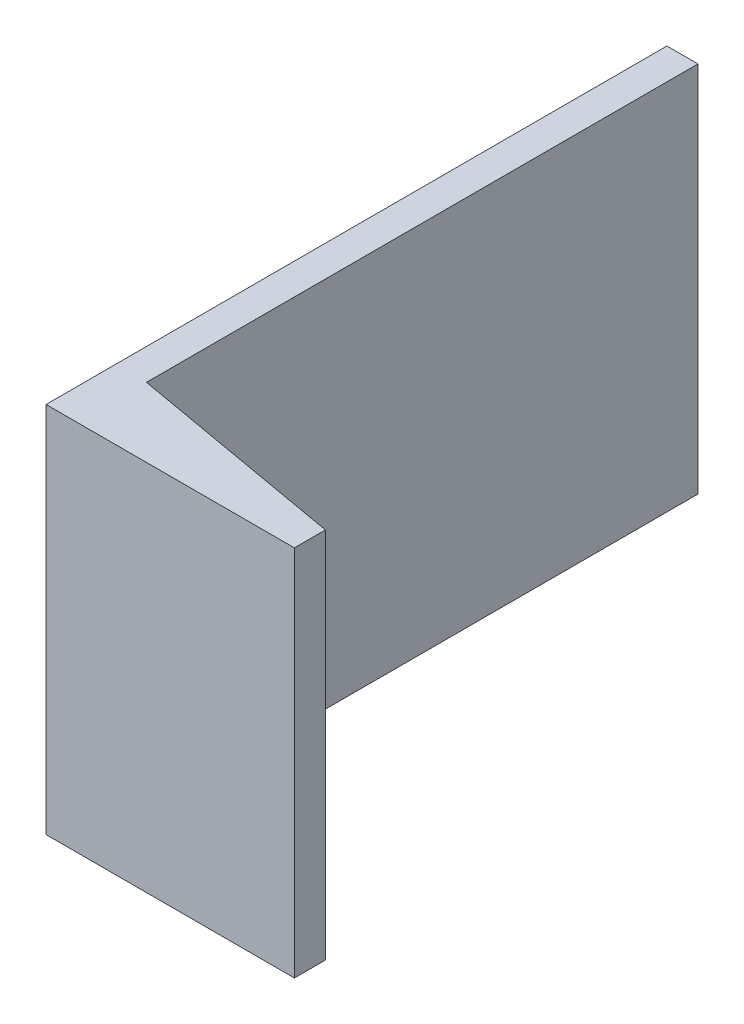
ISO-10303-21;
HEADER;
FILE_DESCRIPTION(('STEP AP214'),'2;1');
FILE_NAME('part.step','',(''),(''),'','','');
FILE_SCHEMA(('AUTOMOTIVE_DESIGN { 1 0 10303 214 1 1 1 1 }'));
ENDSEC;
DATA;
#1=APPLICATION_CONTEXT('core data for automotive mechanical design processes');
#2=APPLICATION_PROTOCOL_DEFINITION('international standard','automotive_design',2000,#1);
#3=PRODUCT_CONTEXT('',#1,'mechanical');
#4=PRODUCT('Part','Part','',(#3));
#5=PRODUCT_RELATED_PRODUCT_CATEGORY('part','',(#4));
#6=PRODUCT_DEFINITION_FORMATION('','',#4);
#7=PRODUCT_DEFINITION_CONTEXT('part definition',#1,'design');
#8=PRODUCT_DEFINITION('design','',#6,#7);
#9=PRODUCT_DEFINITION_SHAPE('','',#8);
#10=(LENGTH_UNIT() NAMED_UNIT(*) SI_UNIT(.MILLI.,.METRE.));
#11=(NAMED_UNIT(*) PLANE_ANGLE_UNIT() SI_UNIT($,.RADIAN.));
#12=(NAMED_UNIT(*) SI_UNIT($,.STERADIAN.) SOLID_ANGLE_UNIT());
#13=UNCERTAINTY_MEASURE_WITH_UNIT(LENGTH_MEASURE(1.E-05),#10,'distance_accuracy_value','');
#14=(GEOMETRIC_REPRESENTATION_CONTEXT(3) GLOBAL_UNCERTAINTY_ASSIGNED_CONTEXT((#13)) GLOBAL_UNIT_ASSIGNED_CONTEXT((#10,
#11,#12)) REPRESENTATION_CONTEXT('',''));
#15=CARTESIAN_POINT('',(0.,0.,0.));
#16=DIRECTION('',(0.,0.,1.));
#17=DIRECTION('',(1.,0.,0.));
#18=AXIS2_PLACEMENT_3D('',#15,#16,#17);
#19=CARTESIAN_POINT('',(0.,76.2,-127.));
#20=DIRECTION('',(1.,0.,0.));
#21=DIRECTION('',(0.,0.,-1.));
#22=AXIS2_PLACEMENT_3D('',#19,#20,#21);
#23=PLANE('',#22);
#24=DIRECTION('',(0.,0.,1.));
#25=VECTOR('',#24,1.);
#26=CARTESIAN_POINT('',(0.,0.,-127.));
#27=LINE('',#26,#25);
#28=CARTESIAN_POINT('',(0.,0.,-127.));
#29=VERTEX_POINT('',#28);
#30=CARTESIAN_POINT('',(0.,0.,0.));
#31=VERTEX_POINT('',#30);
#32=EDGE_CURVE('E117',#29,#31,#27,.T.);
#33=ORIENTED_EDGE('',*,*,#32,.T.);
#34=DIRECTION('',(0.,-1.,0.));
#35=VECTOR('',#34,1.);
#36=CARTESIAN_POINT('',(0.,76.2,0.));
#37=LINE('',#36,#35);
#38=CARTESIAN_POINT('',(0.,76.2,0.));
#39=VERTEX_POINT('',#38);
#40=EDGE_CURVE('E11',#39,#31,#37,.T.);
#41=ORIENTED_EDGE('',*,*,#40,.F.);
#42=DIRECTION('',(0.,0.,1.));
#43=VECTOR('',#42,1.);
#44=CARTESIAN_POINT('',(0.,76.2,-127.));
#45=LINE('',#44,#43);
#46=CARTESIAN_POINT('',(0.,76.2,-127.));
#47=VERTEX_POINT('',#46);
#48=EDGE_CURVE('E127',#47,#39,#45,.T.);
#49=ORIENTED_EDGE('',*,*,#48,.F.);
#50=DIRECTION('',(0.,-1.,0.));
#51=VECTOR('',#50,1.);
#52=CARTESIAN_POINT('',(0.,76.2,-127.));
#53=LINE('',#52,#51);
#54=EDGE_CURVE('E113',#47,#29,#53,.T.);
#55=ORIENTED_EDGE('',*,*,#54,.T.);
#56=EDGE_LOOP('',(#33,#41,#49,#55));
#57=FACE_BOUND('',#56,.T.);
#58=ADVANCED_FACE('F33',(#57),#23,.F.);
#59=CARTESIAN_POINT('',(0.,76.2,0.));
#60=DIRECTION('',(0.,0.,-1.));
#61=DIRECTION('',(-1.,0.,0.));
#62=AXIS2_PLACEMENT_3D('',#59,#60,#61);
#63=PLANE('',#62);
#64=DIRECTION('',(1.,0.,0.));
#65=VECTOR('',#64,1.);
#66=CARTESIAN_POINT('',(0.,0.,0.));
#67=LINE('',#66,#65);
#68=CARTESIAN_POINT('',(50.8,0.,0.));
#69=VERTEX_POINT('',#68);
#70=EDGE_CURVE('E120',#31,#69,#67,.T.);
#71=ORIENTED_EDGE('',*,*,#70,.T.);
#72=DIRECTION('',(0.,-1.,0.));
#73=VECTOR('',#72,1.);
#74=CARTESIAN_POINT('',(50.8,76.2,0.));
#75=LINE('',#74,#73);
#76=CARTESIAN_POINT('',(50.8,76.2,0.));
#77=VERTEX_POINT('',#76);
#78=EDGE_CURVE('E41',#77,#69,#75,.T.);
#79=ORIENTED_EDGE('',*,*,#78,.F.);
#80=DIRECTION('',(1.,0.,0.));
#81=VECTOR('',#80,1.);
#82=CARTESIAN_POINT('',(0.,76.2,0.));
#83=LINE('',#82,#81);
#84=EDGE_CURVE('E86',#39,#77,#83,.T.);
#85=ORIENTED_EDGE('',*,*,#84,.F.);
#86=ORIENTED_EDGE('',*,*,#40,.T.);
#87=EDGE_LOOP('',(#71,#79,#85,#86));
#88=FACE_BOUND('',#87,.T.);
#89=ADVANCED_FACE('F151',(#88),#63,.F.);
#90=CARTESIAN_POINT('',(50.8,76.2,0.));
#91=DIRECTION('',(-1.,0.,0.));
#92=DIRECTION('',(0.,0.,1.));
#93=AXIS2_PLACEMENT_3D('',#90,#91,#92);
#94=PLANE('',#93);
#95=DIRECTION('',(0.,0.,-1.));
#96=VECTOR('',#95,1.);
#97=CARTESIAN_POINT('',(50.8,0.,0.));
#98=LINE('',#97,#96);
#99=CARTESIAN_POINT('',(50.8,0.,-6.35));
#100=VERTEX_POINT('',#99);
#101=EDGE_CURVE('E122',#69,#100,#98,.T.);
#102=ORIENTED_EDGE('',*,*,#101,.T.);
#103=DIRECTION('',(0.,-1.,0.));
#104=VECTOR('',#103,1.);
#105=CARTESIAN_POINT('',(50.8,76.2,-6.35));
#106=LINE('',#105,#104);
#107=CARTESIAN_POINT('',(50.8,76.2,-6.35));
#108=VERTEX_POINT('',#107);
#109=EDGE_CURVE('E108',#108,#100,#106,.T.);
#110=ORIENTED_EDGE('',*,*,#109,.F.);
#111=DIRECTION('',(0.,0.,-1.));
#112=VECTOR('',#111,1.);
#113=CARTESIAN_POINT('',(50.8,76.2,0.));
#114=LINE('',#113,#112);
#115=EDGE_CURVE('E99',#77,#108,#114,.T.);
#116=ORIENTED_EDGE('',*,*,#115,.F.);
#117=ORIENTED_EDGE('',*,*,#78,.T.);
#118=EDGE_LOOP('',(#102,#110,#116,#117));
#119=FACE_BOUND('',#118,.T.);
#120=ADVANCED_FACE('F133',(#119),#94,.F.);
#121=CARTESIAN_POINT('',(50.8,76.2,-6.35));
#122=DIRECTION('',(-0.173648177666923,0.,0.984807753012209));
#123=DIRECTION('',(0.984807753012209,0.,0.173648177666923));
#124=AXIS2_PLACEMENT_3D('',#121,#122,#123);
#125=PLANE('',#124);
#126=DIRECTION('',(-0.984807753012209,0.,-0.173648177666923));
#127=VECTOR('',#126,1.);
#128=CARTESIAN_POINT('',(50.8,0.,-6.35));
#129=LINE('',#128,#127);
#130=CARTESIAN_POINT('',(6.35000000000002,0.,-14.1877342924909));
#131=VERTEX_POINT('',#130);
#132=EDGE_CURVE('E107',#100,#131,#129,.T.);
#133=ORIENTED_EDGE('',*,*,#132,.T.);
#134=DIRECTION('',(0.,-1.,0.));
#135=VECTOR('',#134,1.);
#136=CARTESIAN_POINT('',(6.35000000000002,76.2,-14.1877342924909));
#137=LINE('',#136,#135);
#138=CARTESIAN_POINT('',(6.35000000000002,76.2,-14.1877342924909));
#139=VERTEX_POINT('',#138);
#140=EDGE_CURVE('E104',#139,#131,#137,.T.);
#141=ORIENTED_EDGE('',*,*,#140,.F.);
#142=DIRECTION('',(-0.984807753012209,0.,-0.173648177666923));
#143=VECTOR('',#142,1.);
#144=CARTESIAN_POINT('',(50.8,76.2,-6.35));
#145=LINE('',#144,#143);
#146=EDGE_CURVE('E93',#108,#139,#145,.T.);
#147=ORIENTED_EDGE('',*,*,#146,.F.);
#148=ORIENTED_EDGE('',*,*,#109,.T.);
#149=EDGE_LOOP('',(#133,#141,#147,#148));
#150=FACE_BOUND('',#149,.T.);
#151=ADVANCED_FACE('F105',(#150),#125,.F.);
#152=CARTESIAN_POINT('',(6.35000000000002,76.2,-14.1877342924909));
#153=DIRECTION('',(-1.,0.,0.));
#154=DIRECTION('',(0.,0.,1.));
#155=AXIS2_PLACEMENT_3D('',#152,#153,#154);
#156=PLANE('',#155);
#157=DIRECTION('',(0.,0.,-1.));
#158=VECTOR('',#157,1.);
#159=CARTESIAN_POINT('',(6.35000000000002,0.,-14.1877342924909));
#160=LINE('',#159,#158);
#161=CARTESIAN_POINT('',(6.35000000000001,0.,-127.));
#162=VERTEX_POINT('',#161);
#163=EDGE_CURVE('E72',#131,#162,#160,.T.);
#164=ORIENTED_EDGE('',*,*,#163,.T.);
#165=DIRECTION('',(0.,-1.,0.));
#166=VECTOR('',#165,1.);
#167=CARTESIAN_POINT('',(6.35000000000001,76.2,-127.));
#168=LINE('',#167,#166);
#169=CARTESIAN_POINT('',(6.35000000000001,76.2,-127.));
#170=VERTEX_POINT('',#169);
#171=EDGE_CURVE('E109',#170,#162,#168,.T.);
#172=ORIENTED_EDGE('',*,*,#171,.F.);
#173=DIRECTION('',(0.,0.,-1.));
#174=VECTOR('',#173,1.);
#175=CARTESIAN_POINT('',(6.35000000000002,76.2,-14.1877342924909));
#176=LINE('',#175,#174);
#177=EDGE_CURVE('E97',#139,#170,#176,.T.);
#178=ORIENTED_EDGE('',*,*,#177,.F.);
#179=ORIENTED_EDGE('',*,*,#140,.T.);
#180=EDGE_LOOP('',(#164,#172,#178,#179));
#181=FACE_BOUND('',#180,.T.);
#182=ADVANCED_FACE('F111',(#181),#156,.F.);
#183=CARTESIAN_POINT('',(6.35000000000001,76.2,-127.));
#184=DIRECTION('',(0.,0.,1.));
#185=DIRECTION('',(1.,0.,0.));
#186=AXIS2_PLACEMENT_3D('',#183,#184,#185);
#187=PLANE('',#186);
#188=DIRECTION('',(-1.,0.,0.));
#189=VECTOR('',#188,1.);
#190=CARTESIAN_POINT('',(6.35000000000001,0.,-127.));
#191=LINE('',#190,#189);
#192=EDGE_CURVE('E78',#162,#29,#191,.T.);
#193=ORIENTED_EDGE('',*,*,#192,.T.);
#194=ORIENTED_EDGE('',*,*,#54,.F.);
#195=DIRECTION('',(-1.,0.,0.));
#196=VECTOR('',#195,1.);
#197=CARTESIAN_POINT('',(6.35000000000001,76.2,-127.));
#198=LINE('',#197,#196);
#199=EDGE_CURVE('E49',#170,#47,#198,.T.);
#200=ORIENTED_EDGE('',*,*,#199,.F.);
#201=ORIENTED_EDGE('',*,*,#171,.T.);
#202=EDGE_LOOP('',(#193,#194,#200,#201));
#203=FACE_BOUND('',#202,.T.);
#204=ADVANCED_FACE('F140',(#203),#187,.F.);
#205=CARTESIAN_POINT('',(0.,76.2,0.));
#206=DIRECTION('',(0.,1.,0.));
#207=DIRECTION('',(0.,0.,1.));
#208=AXIS2_PLACEMENT_3D('',#205,#206,#207);
#209=PLANE('',#208);
#210=ORIENTED_EDGE('',*,*,#48,.T.);
#211=ORIENTED_EDGE('',*,*,#84,.T.);
#212=ORIENTED_EDGE('',*,*,#115,.T.);
#213=ORIENTED_EDGE('',*,*,#146,.T.);
#214=ORIENTED_EDGE('',*,*,#177,.T.);
#215=ORIENTED_EDGE('',*,*,#199,.T.);
#216=EDGE_LOOP('',(#210,#211,#212,#213,#214,#215));
#217=FACE_BOUND('',#216,.T.);
#218=ADVANCED_FACE('F95',(#217),#209,.T.);
#219=CARTESIAN_POINT('',(0.,0.,0.));
#220=DIRECTION('',(0.,1.,0.));
#221=DIRECTION('',(0.,0.,1.));
#222=AXIS2_PLACEMENT_3D('',#219,#220,#221);
#223=PLANE('',#222);
#224=ORIENTED_EDGE('',*,*,#32,.F.);
#225=ORIENTED_EDGE('',*,*,#192,.F.);
#226=ORIENTED_EDGE('',*,*,#163,.F.);
#227=ORIENTED_EDGE('',*,*,#132,.F.);
#228=ORIENTED_EDGE('',*,*,#101,.F.);
#229=ORIENTED_EDGE('',*,*,#70,.F.);
#230=EDGE_LOOP('',(#224,#225,#226,#227,#228,#229));
#231=FACE_BOUND('',#230,.T.);
#232=ADVANCED_FACE('F136',(#231),#223,.F.);
#233=CLOSED_SHELL('',(#58,#89,#120,#151,#182,#204,#218,#232));
#234=MANIFOLD_SOLID_BREP('B2',#233);
#235=ADVANCED_BREP_SHAPE_REPRESENTATION('',(#18,#234),#14);
#236=SHAPE_DEFINITION_REPRESENTATION(#9,#235);
ENDSEC;
END-ISO-10303-21;
